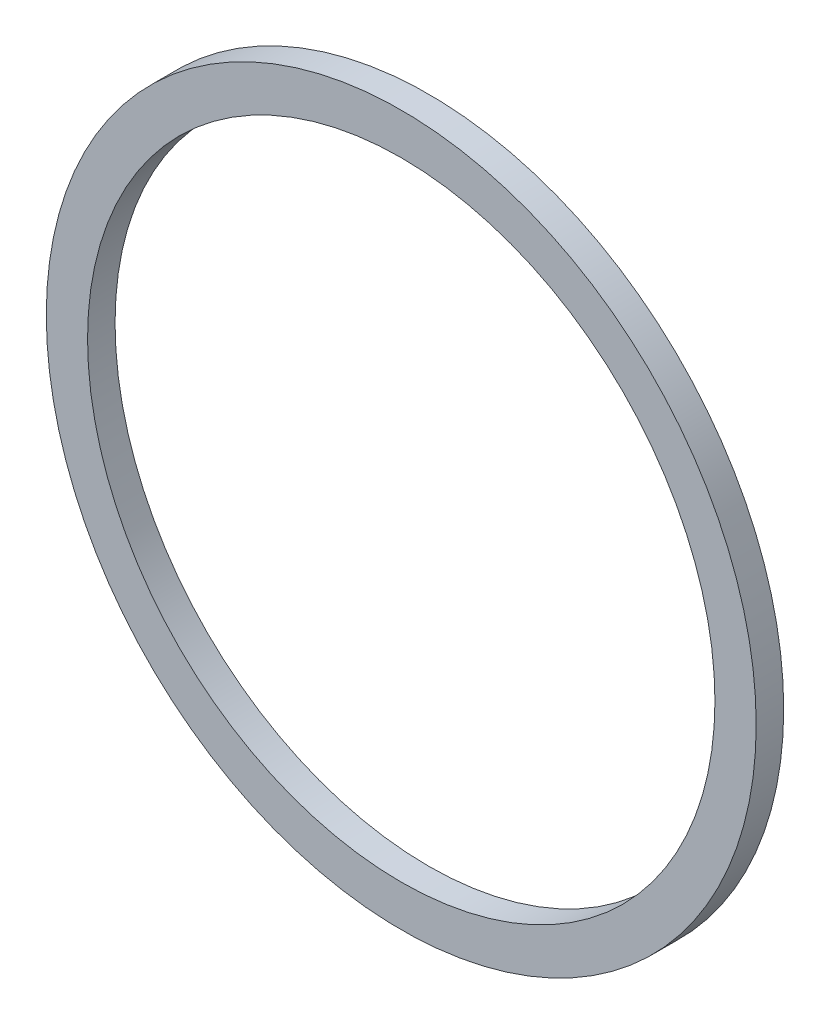
ISO-10303-21;
HEADER;
FILE_DESCRIPTION(('STEP AP214'),'2;1');
FILE_NAME('part.step','',(''),(''),'','','');
FILE_SCHEMA(('AUTOMOTIVE_DESIGN { 1 0 10303 214 1 1 1 1 }'));
ENDSEC;
DATA;
#1=APPLICATION_CONTEXT('core data for automotive mechanical design processes');
#2=APPLICATION_PROTOCOL_DEFINITION('international standard','automotive_design',2000,#1);
#3=PRODUCT_CONTEXT('',#1,'mechanical');
#4=PRODUCT('Part','Part','',(#3));
#5=PRODUCT_RELATED_PRODUCT_CATEGORY('part','',(#4));
#6=PRODUCT_DEFINITION_FORMATION('','',#4);
#7=PRODUCT_DEFINITION_CONTEXT('part definition',#1,'design');
#8=PRODUCT_DEFINITION('design','',#6,#7);
#9=PRODUCT_DEFINITION_SHAPE('','',#8);
#10=(LENGTH_UNIT() NAMED_UNIT(*) SI_UNIT(.MILLI.,.METRE.));
#11=(NAMED_UNIT(*) PLANE_ANGLE_UNIT() SI_UNIT($,.RADIAN.));
#12=(NAMED_UNIT(*) SI_UNIT($,.STERADIAN.) SOLID_ANGLE_UNIT());
#13=UNCERTAINTY_MEASURE_WITH_UNIT(LENGTH_MEASURE(1.E-05),#10,'distance_accuracy_value','');
#14=(GEOMETRIC_REPRESENTATION_CONTEXT(3) GLOBAL_UNCERTAINTY_ASSIGNED_CONTEXT((#13)) GLOBAL_UNIT_ASSIGNED_CONTEXT((#10,
#11,#12)) REPRESENTATION_CONTEXT('',''));
#15=CARTESIAN_POINT('',(0.,0.,0.));
#16=DIRECTION('',(0.,0.,1.));
#17=DIRECTION('',(1.,0.,0.));
#18=AXIS2_PLACEMENT_3D('',#15,#16,#17);
#19=CARTESIAN_POINT('',(0.,-76.2,6.35));
#20=DIRECTION('',(0.,0.,1.));
#21=DIRECTION('',(1.,0.,0.));
#22=AXIS2_PLACEMENT_3D('',#19,#20,#21);
#23=PLANE('',#22);
#24=CARTESIAN_POINT('',(0.,-76.2,6.35));
#25=DIRECTION('',(0.,0.,1.));
#26=DIRECTION('',(1.,0.,0.));
#27=AXIS2_PLACEMENT_3D('',#24,#25,#26);
#28=CIRCLE('',#27,81.9404);
#29=CARTESIAN_POINT('',(81.9404,-76.2,6.35));
#30=VERTEX_POINT('',#29);
#31=EDGE_CURVE('E10',#30,#30,#28,.T.);
#32=ORIENTED_EDGE('',*,*,#31,.T.);
#33=EDGE_LOOP('',(#32));
#34=FACE_BOUND('',#33,.T.);
#35=CARTESIAN_POINT('',(0.,-76.2,6.35));
#36=DIRECTION('',(0.,0.,1.));
#37=DIRECTION('',(1.,0.,0.));
#38=AXIS2_PLACEMENT_3D('',#35,#36,#37);
#39=CIRCLE('',#38,72.4154);
#40=CARTESIAN_POINT('',(72.4154,-76.2,6.35));
#41=VERTEX_POINT('',#40);
#42=EDGE_CURVE('E42',#41,#41,#39,.T.);
#43=ORIENTED_EDGE('',*,*,#42,.F.);
#44=EDGE_LOOP('',(#43));
#45=FACE_BOUND('',#44,.T.);
#46=ADVANCED_FACE('F31',(#34,#45),#23,.T.);
#47=CARTESIAN_POINT('',(0.,-76.2,0.));
#48=DIRECTION('',(0.,0.,1.));
#49=DIRECTION('',(1.,0.,0.));
#50=AXIS2_PLACEMENT_3D('',#47,#48,#49);
#51=PLANE('',#50);
#52=CARTESIAN_POINT('',(0.,-76.2,0.));
#53=DIRECTION('',(0.,0.,1.));
#54=DIRECTION('',(1.,0.,0.));
#55=AXIS2_PLACEMENT_3D('',#52,#53,#54);
#56=CIRCLE('',#55,81.9404);
#57=CARTESIAN_POINT('',(81.9404,-76.2,0.));
#58=VERTEX_POINT('',#57);
#59=EDGE_CURVE('E35',#58,#58,#56,.T.);
#60=ORIENTED_EDGE('',*,*,#59,.F.);
#61=EDGE_LOOP('',(#60));
#62=FACE_BOUND('',#61,.T.);
#63=CARTESIAN_POINT('',(0.,-76.2,0.));
#64=DIRECTION('',(0.,0.,1.));
#65=DIRECTION('',(1.,0.,0.));
#66=AXIS2_PLACEMENT_3D('',#63,#64,#65);
#67=CIRCLE('',#66,72.4154);
#68=CARTESIAN_POINT('',(72.4154,-76.2,0.));
#69=VERTEX_POINT('',#68);
#70=EDGE_CURVE('E44',#69,#69,#67,.T.);
#71=ORIENTED_EDGE('',*,*,#70,.T.);
#72=EDGE_LOOP('',(#71));
#73=FACE_BOUND('',#72,.T.);
#74=ADVANCED_FACE('F54',(#62,#73),#51,.F.);
#75=CARTESIAN_POINT('',(0.,-76.2,6.35));
#76=DIRECTION('',(0.,0.,-1.));
#77=DIRECTION('',(-1.,0.,0.));
#78=AXIS2_PLACEMENT_3D('',#75,#76,#77);
#79=CYLINDRICAL_SURFACE('',#78,81.9404);
#80=ORIENTED_EDGE('',*,*,#31,.F.);
#81=EDGE_LOOP('',(#80));
#82=FACE_BOUND('',#81,.T.);
#83=ORIENTED_EDGE('',*,*,#59,.T.);
#84=EDGE_LOOP('',(#83));
#85=FACE_BOUND('',#84,.T.);
#86=ADVANCED_FACE('F33',(#82,#85),#79,.T.);
#87=CARTESIAN_POINT('',(0.,-76.2,6.35));
#88=DIRECTION('',(0.,0.,-1.));
#89=DIRECTION('',(-1.,0.,0.));
#90=AXIS2_PLACEMENT_3D('',#87,#88,#89);
#91=CYLINDRICAL_SURFACE('',#90,72.4154);
#92=ORIENTED_EDGE('',*,*,#42,.T.);
#93=EDGE_LOOP('',(#92));
#94=FACE_BOUND('',#93,.T.);
#95=ORIENTED_EDGE('',*,*,#70,.F.);
#96=EDGE_LOOP('',(#95));
#97=FACE_BOUND('',#96,.T.);
#98=ADVANCED_FACE('F50',(#94,#97),#91,.F.);
#99=CLOSED_SHELL('',(#46,#74,#86,#98));
#100=MANIFOLD_SOLID_BREP('B2',#99);
#101=ADVANCED_BREP_SHAPE_REPRESENTATION('',(#18,#100),#14);
#102=SHAPE_DEFINITION_REPRESENTATION(#9,#101);
ENDSEC;
END-ISO-10303-21;
